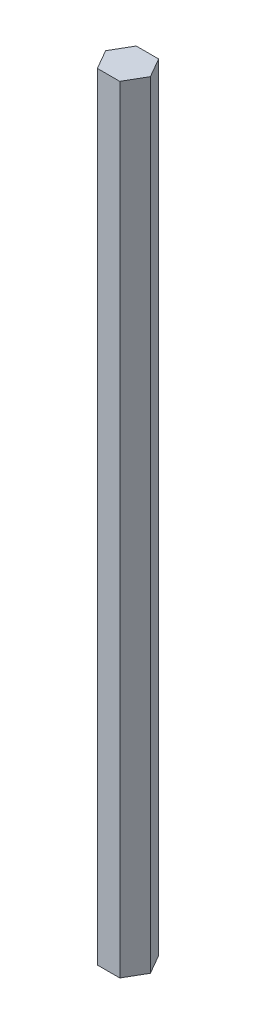
ISO-10303-21;
HEADER;
FILE_DESCRIPTION(('STEP AP214'),'2;1');
FILE_NAME('part.step','',(''),(''),'','','');
FILE_SCHEMA(('AUTOMOTIVE_DESIGN { 1 0 10303 214 1 1 1 1 }'));
ENDSEC;
DATA;
#1=APPLICATION_CONTEXT('core data for automotive mechanical design processes');
#2=APPLICATION_PROTOCOL_DEFINITION('international standard','automotive_design',2000,#1);
#3=PRODUCT_CONTEXT('',#1,'mechanical');
#4=PRODUCT('Part','Part','',(#3));
#5=PRODUCT_RELATED_PRODUCT_CATEGORY('part','',(#4));
#6=PRODUCT_DEFINITION_FORMATION('','',#4);
#7=PRODUCT_DEFINITION_CONTEXT('part definition',#1,'design');
#8=PRODUCT_DEFINITION('design','',#6,#7);
#9=PRODUCT_DEFINITION_SHAPE('','',#8);
#10=(LENGTH_UNIT() NAMED_UNIT(*) SI_UNIT(.MILLI.,.METRE.));
#11=(NAMED_UNIT(*) PLANE_ANGLE_UNIT() SI_UNIT($,.RADIAN.));
#12=(NAMED_UNIT(*) SI_UNIT($,.STERADIAN.) SOLID_ANGLE_UNIT());
#13=UNCERTAINTY_MEASURE_WITH_UNIT(LENGTH_MEASURE(1.E-05),#10,'distance_accuracy_value','');
#14=(GEOMETRIC_REPRESENTATION_CONTEXT(3) GLOBAL_UNCERTAINTY_ASSIGNED_CONTEXT((#13)) GLOBAL_UNIT_ASSIGNED_CONTEXT((#10,
#11,#12)) REPRESENTATION_CONTEXT('',''));
#15=CARTESIAN_POINT('',(0.,0.,0.));
#16=DIRECTION('',(0.,0.,1.));
#17=DIRECTION('',(1.,0.,0.));
#18=AXIS2_PLACEMENT_3D('',#15,#16,#17);
#19=CARTESIAN_POINT('',(3.6661742093541,254.,-6.34999999999999));
#20=DIRECTION('',(0.,0.,1.));
#21=DIRECTION('',(1.,0.,0.));
#22=AXIS2_PLACEMENT_3D('',#19,#20,#21);
#23=PLANE('',#22);
#24=DIRECTION('',(-1.,0.,0.));
#25=VECTOR('',#24,1.);
#26=CARTESIAN_POINT('',(3.6661742093541,0.,-6.34999999999999));
#27=LINE('',#26,#25);
#28=CARTESIAN_POINT('',(3.6661742093541,0.,-6.34999999999999));
#29=VERTEX_POINT('',#28);
#30=CARTESIAN_POINT('',(-3.66617420935414,0.,-6.34999999999996));
#31=VERTEX_POINT('',#30);
#32=EDGE_CURVE('E117',#29,#31,#27,.T.);
#33=ORIENTED_EDGE('',*,*,#32,.T.);
#34=DIRECTION('',(0.,-1.,0.));
#35=VECTOR('',#34,1.);
#36=CARTESIAN_POINT('',(-3.66617420935414,254.,-6.34999999999996));
#37=LINE('',#36,#35);
#38=CARTESIAN_POINT('',(-3.66617420935414,254.,-6.34999999999996));
#39=VERTEX_POINT('',#38);
#40=EDGE_CURVE('E11',#39,#31,#37,.T.);
#41=ORIENTED_EDGE('',*,*,#40,.F.);
#42=DIRECTION('',(-1.,0.,0.));
#43=VECTOR('',#42,1.);
#44=CARTESIAN_POINT('',(3.6661742093541,254.,-6.34999999999999));
#45=LINE('',#44,#43);
#46=CARTESIAN_POINT('',(3.6661742093541,254.,-6.34999999999999));
#47=VERTEX_POINT('',#46);
#48=EDGE_CURVE('E127',#47,#39,#45,.T.);
#49=ORIENTED_EDGE('',*,*,#48,.F.);
#50=DIRECTION('',(0.,-1.,0.));
#51=VECTOR('',#50,1.);
#52=CARTESIAN_POINT('',(3.6661742093541,254.,-6.34999999999999));
#53=LINE('',#52,#51);
#54=EDGE_CURVE('E113',#47,#29,#53,.T.);
#55=ORIENTED_EDGE('',*,*,#54,.T.);
#56=EDGE_LOOP('',(#33,#41,#49,#55));
#57=FACE_BOUND('',#56,.T.);
#58=ADVANCED_FACE('F33',(#57),#23,.F.);
#59=CARTESIAN_POINT('',(-3.66617420935414,254.,-6.34999999999996));
#60=DIRECTION('',(0.866025403784441,0.,0.499999999999995));
#61=DIRECTION('',(0.499999999999995,0.,-0.866025403784442));
#62=AXIS2_PLACEMENT_3D('',#59,#60,#61);
#63=PLANE('',#62);
#64=DIRECTION('',(-0.499999999999995,0.,0.866025403784441));
#65=VECTOR('',#64,1.);
#66=CARTESIAN_POINT('',(-3.66617420935414,0.,-6.34999999999996));
#67=LINE('',#66,#65);
#68=CARTESIAN_POINT('',(-7.33234841870822,0.,0.));
#69=VERTEX_POINT('',#68);
#70=EDGE_CURVE('E120',#31,#69,#67,.T.);
#71=ORIENTED_EDGE('',*,*,#70,.T.);
#72=DIRECTION('',(0.,-1.,0.));
#73=VECTOR('',#72,1.);
#74=CARTESIAN_POINT('',(-7.33234841870822,254.,0.));
#75=LINE('',#74,#73);
#76=CARTESIAN_POINT('',(-7.33234841870822,254.,0.));
#77=VERTEX_POINT('',#76);
#78=EDGE_CURVE('E41',#77,#69,#75,.T.);
#79=ORIENTED_EDGE('',*,*,#78,.F.);
#80=DIRECTION('',(-0.499999999999995,0.,0.866025403784441));
#81=VECTOR('',#80,1.);
#82=CARTESIAN_POINT('',(-3.66617420935414,254.,-6.34999999999996));
#83=LINE('',#82,#81);
#84=EDGE_CURVE('E86',#39,#77,#83,.T.);
#85=ORIENTED_EDGE('',*,*,#84,.F.);
#86=ORIENTED_EDGE('',*,*,#40,.T.);
#87=EDGE_LOOP('',(#71,#79,#85,#86));
#88=FACE_BOUND('',#87,.T.);
#89=ADVANCED_FACE('F151',(#88),#63,.F.);
#90=CARTESIAN_POINT('',(-7.33234841870822,254.,0.));
#91=DIRECTION('',(0.866025403784435,0.,-0.500000000000007));
#92=DIRECTION('',(-0.500000000000007,0.,-0.866025403784435));
#93=AXIS2_PLACEMENT_3D('',#90,#91,#92);
#94=PLANE('',#93);
#95=DIRECTION('',(0.500000000000007,0.,0.866025403784435));
#96=VECTOR('',#95,1.);
#97=CARTESIAN_POINT('',(-7.33234841870822,0.,0.));
#98=LINE('',#97,#96);
#99=CARTESIAN_POINT('',(-3.66617420935405,0.,6.35000000000001));
#100=VERTEX_POINT('',#99);
#101=EDGE_CURVE('E122',#69,#100,#98,.T.);
#102=ORIENTED_EDGE('',*,*,#101,.T.);
#103=DIRECTION('',(0.,-1.,0.));
#104=VECTOR('',#103,1.);
#105=CARTESIAN_POINT('',(-3.66617420935405,254.,6.35000000000001));
#106=LINE('',#105,#104);
#107=CARTESIAN_POINT('',(-3.66617420935405,254.,6.35000000000001));
#108=VERTEX_POINT('',#107);
#109=EDGE_CURVE('E108',#108,#100,#106,.T.);
#110=ORIENTED_EDGE('',*,*,#109,.F.);
#111=DIRECTION('',(0.500000000000007,0.,0.866025403784435));
#112=VECTOR('',#111,1.);
#113=CARTESIAN_POINT('',(-7.33234841870822,254.,0.));
#114=LINE('',#113,#112);
#115=EDGE_CURVE('E99',#77,#108,#114,.T.);
#116=ORIENTED_EDGE('',*,*,#115,.F.);
#117=ORIENTED_EDGE('',*,*,#78,.T.);
#118=EDGE_LOOP('',(#102,#110,#116,#117));
#119=FACE_BOUND('',#118,.T.);
#120=ADVANCED_FACE('F133',(#119),#94,.F.);
#121=CARTESIAN_POINT('',(-3.66617420935405,254.,6.35000000000001));
#122=DIRECTION('',(0.,0.,-1.));
#123=DIRECTION('',(-1.,0.,0.));
#124=AXIS2_PLACEMENT_3D('',#121,#122,#123);
#125=PLANE('',#124);
#126=DIRECTION('',(1.,0.,0.));
#127=VECTOR('',#126,1.);
#128=CARTESIAN_POINT('',(-3.66617420935405,0.,6.35000000000001));
#129=LINE('',#128,#127);
#130=CARTESIAN_POINT('',(3.66617420935418,0.,6.34999999999994));
#131=VERTEX_POINT('',#130);
#132=EDGE_CURVE('E107',#100,#131,#129,.T.);
#133=ORIENTED_EDGE('',*,*,#132,.T.);
#134=DIRECTION('',(0.,-1.,0.));
#135=VECTOR('',#134,1.);
#136=CARTESIAN_POINT('',(3.66617420935418,254.,6.34999999999994));
#137=LINE('',#136,#135);
#138=CARTESIAN_POINT('',(3.66617420935418,254.,6.34999999999994));
#139=VERTEX_POINT('',#138);
#140=EDGE_CURVE('E104',#139,#131,#137,.T.);
#141=ORIENTED_EDGE('',*,*,#140,.F.);
#142=DIRECTION('',(1.,0.,0.));
#143=VECTOR('',#142,1.);
#144=CARTESIAN_POINT('',(-3.66617420935405,254.,6.35000000000001));
#145=LINE('',#144,#143);
#146=EDGE_CURVE('E93',#108,#139,#145,.T.);
#147=ORIENTED_EDGE('',*,*,#146,.F.);
#148=ORIENTED_EDGE('',*,*,#109,.T.);
#149=EDGE_LOOP('',(#133,#141,#147,#148));
#150=FACE_BOUND('',#149,.T.);
#151=ADVANCED_FACE('F105',(#150),#125,.F.);
#152=CARTESIAN_POINT('',(3.66617420935418,254.,6.34999999999994));
#153=DIRECTION('',(-0.866025403784442,0.,-0.499999999999995));
#154=DIRECTION('',(-0.499999999999995,0.,0.866025403784442));
#155=AXIS2_PLACEMENT_3D('',#152,#153,#154);
#156=PLANE('',#155);
#157=DIRECTION('',(0.499999999999995,0.,-0.866025403784442));
#158=VECTOR('',#157,1.);
#159=CARTESIAN_POINT('',(3.66617420935418,0.,6.34999999999994));
#160=LINE('',#159,#158);
#161=CARTESIAN_POINT('',(7.33234841870822,0.,0.));
#162=VERTEX_POINT('',#161);
#163=EDGE_CURVE('E72',#131,#162,#160,.T.);
#164=ORIENTED_EDGE('',*,*,#163,.T.);
#165=DIRECTION('',(0.,-1.,0.));
#166=VECTOR('',#165,1.);
#167=CARTESIAN_POINT('',(7.33234841870822,254.,0.));
#168=LINE('',#167,#166);
#169=CARTESIAN_POINT('',(7.33234841870822,254.,0.));
#170=VERTEX_POINT('',#169);
#171=EDGE_CURVE('E109',#170,#162,#168,.T.);
#172=ORIENTED_EDGE('',*,*,#171,.F.);
#173=DIRECTION('',(0.499999999999995,0.,-0.866025403784442));
#174=VECTOR('',#173,1.);
#175=CARTESIAN_POINT('',(3.66617420935418,254.,6.34999999999994));
#176=LINE('',#175,#174);
#177=EDGE_CURVE('E97',#139,#170,#176,.T.);
#178=ORIENTED_EDGE('',*,*,#177,.F.);
#179=ORIENTED_EDGE('',*,*,#140,.T.);
#180=EDGE_LOOP('',(#164,#172,#178,#179));
#181=FACE_BOUND('',#180,.T.);
#182=ADVANCED_FACE('F111',(#181),#156,.F.);
#183=CARTESIAN_POINT('',(7.33234841870822,254.,0.));
#184=DIRECTION('',(-0.866025403784438,0.,0.500000000000001));
#185=DIRECTION('',(0.500000000000001,0.,0.866025403784438));
#186=AXIS2_PLACEMENT_3D('',#183,#184,#185);
#187=PLANE('',#186);
#188=DIRECTION('',(-0.500000000000001,0.,-0.866025403784438));
#189=VECTOR('',#188,1.);
#190=CARTESIAN_POINT('',(7.33234841870822,0.,0.));
#191=LINE('',#190,#189);
#192=EDGE_CURVE('E78',#162,#29,#191,.T.);
#193=ORIENTED_EDGE('',*,*,#192,.T.);
#194=ORIENTED_EDGE('',*,*,#54,.F.);
#195=DIRECTION('',(-0.500000000000001,0.,-0.866025403784438));
#196=VECTOR('',#195,1.);
#197=CARTESIAN_POINT('',(7.33234841870822,254.,0.));
#198=LINE('',#197,#196);
#199=EDGE_CURVE('E49',#170,#47,#198,.T.);
#200=ORIENTED_EDGE('',*,*,#199,.F.);
#201=ORIENTED_EDGE('',*,*,#171,.T.);
#202=EDGE_LOOP('',(#193,#194,#200,#201));
#203=FACE_BOUND('',#202,.T.);
#204=ADVANCED_FACE('F140',(#203),#187,.F.);
#205=CARTESIAN_POINT('',(0.,254.,0.));
#206=DIRECTION('',(0.,1.,0.));
#207=DIRECTION('',(0.,0.,1.));
#208=AXIS2_PLACEMENT_3D('',#205,#206,#207);
#209=PLANE('',#208);
#210=ORIENTED_EDGE('',*,*,#48,.T.);
#211=ORIENTED_EDGE('',*,*,#84,.T.);
#212=ORIENTED_EDGE('',*,*,#115,.T.);
#213=ORIENTED_EDGE('',*,*,#146,.T.);
#214=ORIENTED_EDGE('',*,*,#177,.T.);
#215=ORIENTED_EDGE('',*,*,#199,.T.);
#216=EDGE_LOOP('',(#210,#211,#212,#213,#214,#215));
#217=FACE_BOUND('',#216,.T.);
#218=ADVANCED_FACE('F95',(#217),#209,.T.);
#219=CARTESIAN_POINT('',(0.,0.,0.));
#220=DIRECTION('',(0.,1.,0.));
#221=DIRECTION('',(0.,0.,1.));
#222=AXIS2_PLACEMENT_3D('',#219,#220,#221);
#223=PLANE('',#222);
#224=ORIENTED_EDGE('',*,*,#32,.F.);
#225=ORIENTED_EDGE('',*,*,#192,.F.);
#226=ORIENTED_EDGE('',*,*,#163,.F.);
#227=ORIENTED_EDGE('',*,*,#132,.F.);
#228=ORIENTED_EDGE('',*,*,#101,.F.);
#229=ORIENTED_EDGE('',*,*,#70,.F.);
#230=EDGE_LOOP('',(#224,#225,#226,#227,#228,#229));
#231=FACE_BOUND('',#230,.T.);
#232=ADVANCED_FACE('F136',(#231),#223,.F.);
#233=CLOSED_SHELL('',(#58,#89,#120,#151,#182,#204,#218,#232));
#234=MANIFOLD_SOLID_BREP('B2',#233);
#235=ADVANCED_BREP_SHAPE_REPRESENTATION('',(#18,#234),#14);
#236=SHAPE_DEFINITION_REPRESENTATION(#9,#235);
ENDSEC;
END-ISO-10303-21;
